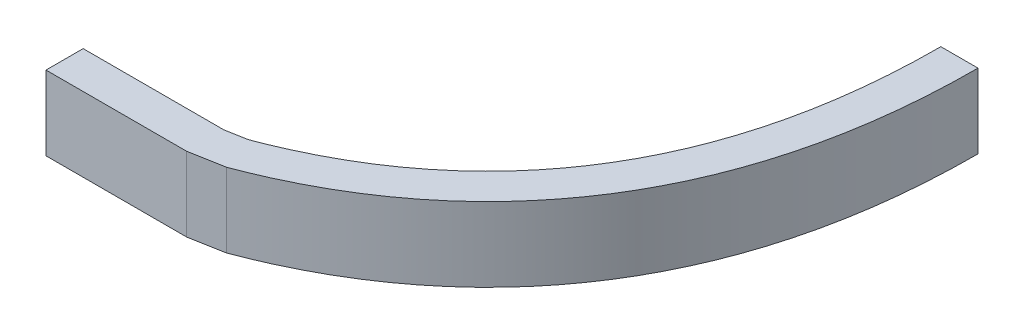
ISO-10303-21;
HEADER;
FILE_DESCRIPTION(('STEP AP214'),'2;1');
FILE_NAME('part.step','',(''),(''),'','','');
FILE_SCHEMA(('AUTOMOTIVE_DESIGN { 1 0 10303 214 1 1 1 1 }'));
ENDSEC;
DATA;
#1=APPLICATION_CONTEXT('core data for automotive mechanical design processes');
#2=APPLICATION_PROTOCOL_DEFINITION('international standard','automotive_design',2000,#1);
#3=PRODUCT_CONTEXT('',#1,'mechanical');
#4=PRODUCT('Part','Part','',(#3));
#5=PRODUCT_RELATED_PRODUCT_CATEGORY('part','',(#4));
#6=PRODUCT_DEFINITION_FORMATION('','',#4);
#7=PRODUCT_DEFINITION_CONTEXT('part definition',#1,'design');
#8=PRODUCT_DEFINITION('design','',#6,#7);
#9=PRODUCT_DEFINITION_SHAPE('','',#8);
#10=(LENGTH_UNIT() NAMED_UNIT(*) SI_UNIT(.MILLI.,.METRE.));
#11=(NAMED_UNIT(*) PLANE_ANGLE_UNIT() SI_UNIT($,.RADIAN.));
#12=(NAMED_UNIT(*) SI_UNIT($,.STERADIAN.) SOLID_ANGLE_UNIT());
#13=UNCERTAINTY_MEASURE_WITH_UNIT(LENGTH_MEASURE(1.E-05),#10,'distance_accuracy_value','');
#14=(GEOMETRIC_REPRESENTATION_CONTEXT(3) GLOBAL_UNCERTAINTY_ASSIGNED_CONTEXT((#13)) GLOBAL_UNIT_ASSIGNED_CONTEXT((#10,
#11,#12)) REPRESENTATION_CONTEXT('',''));
#15=CARTESIAN_POINT('',(0.,0.,0.));
#16=DIRECTION('',(0.,0.,1.));
#17=DIRECTION('',(1.,0.,0.));
#18=AXIS2_PLACEMENT_3D('',#15,#16,#17);
#19=CARTESIAN_POINT('',(-99.9999999999999,0.,0.));
#20=DIRECTION('',(1.,0.,0.));
#21=DIRECTION('',(0.,0.,-1.));
#22=AXIS2_PLACEMENT_3D('',#19,#20,#21);
#23=PLANE('',#22);
#24=DIRECTION('',(0.,0.,1.));
#25=VECTOR('',#24,1.);
#26=CARTESIAN_POINT('',(-99.9999999999999,-0.0001,-29.0149794301952));
#27=LINE('',#26,#25);
#28=CARTESIAN_POINT('',(-99.9999999999999,-0.0001,15.));
#29=VERTEX_POINT('',#28);
#30=CARTESIAN_POINT('',(-99.9999999999999,-0.0001,25.));
#31=VERTEX_POINT('',#30);
#32=EDGE_CURVE('E11',#29,#31,#27,.T.);
#33=ORIENTED_EDGE('',*,*,#32,.T.);
#34=DIRECTION('',(0.,-1.,0.));
#35=VECTOR('',#34,1.);
#36=CARTESIAN_POINT('',(-99.9999999999999,-0.0001,25.));
#37=LINE('',#36,#35);
#38=CARTESIAN_POINT('',(-99.9999999999999,20.,25.));
#39=VERTEX_POINT('',#38);
#40=EDGE_CURVE('E48',#39,#31,#37,.T.);
#41=ORIENTED_EDGE('',*,*,#40,.F.);
#42=DIRECTION('',(0.,0.,1.));
#43=VECTOR('',#42,1.);
#44=CARTESIAN_POINT('',(-99.9999999999999,20.,-29.0149794301952));
#45=LINE('',#44,#43);
#46=CARTESIAN_POINT('',(-99.9999999999999,20.,15.));
#47=VERTEX_POINT('',#46);
#48=EDGE_CURVE('E208',#47,#39,#45,.T.);
#49=ORIENTED_EDGE('',*,*,#48,.F.);
#50=DIRECTION('',(0.,-1.,0.));
#51=VECTOR('',#50,1.);
#52=CARTESIAN_POINT('',(-99.9999999999999,-0.0001,15.));
#53=LINE('',#52,#51);
#54=EDGE_CURVE('E41',#47,#29,#53,.T.);
#55=ORIENTED_EDGE('',*,*,#54,.T.);
#56=EDGE_LOOP('',(#33,#41,#49,#55));
#57=FACE_BOUND('',#56,.T.);
#58=ADVANCED_FACE('F34',(#57),#23,.F.);
#59=CARTESIAN_POINT('',(-56.5192579713654,-0.0001,13.9819282799624));
#60=DIRECTION('',(-0.178366872635727,0.,-0.983964053584352));
#61=DIRECTION('',(-0.983964053584352,0.,0.178366872635727));
#62=AXIS2_PLACEMENT_3D('',#59,#60,#61);
#63=PLANE('',#62);
#64=DIRECTION('',(0.,1.,0.));
#65=VECTOR('',#64,1.);
#66=CARTESIAN_POINT('',(-62.1354688836552,-0.0001,15.));
#67=LINE('',#66,#65);
#68=CARTESIAN_POINT('',(-62.1354688836552,-0.0001,15.));
#69=VERTEX_POINT('',#68);
#70=CARTESIAN_POINT('',(-62.1354688836552,20.,15.));
#71=VERTEX_POINT('',#70);
#72=EDGE_CURVE('E98',#69,#71,#67,.T.);
#73=ORIENTED_EDGE('',*,*,#72,.T.);
#74=DIRECTION('',(-0.983964053584352,0.,0.178366872635727));
#75=VECTOR('',#74,1.);
#76=CARTESIAN_POINT('',(-56.5192579713654,20.,13.9819282799624));
#77=LINE('',#76,#75);
#78=CARTESIAN_POINT('',(-56.5192579713654,20.,13.9819282799624));
#79=VERTEX_POINT('',#78);
#80=EDGE_CURVE('E102',#79,#71,#77,.T.);
#81=ORIENTED_EDGE('',*,*,#80,.F.);
#82=DIRECTION('',(0.,1.,0.));
#83=VECTOR('',#82,1.);
#84=CARTESIAN_POINT('',(-56.5192579713654,-0.0001,13.9819282799624));
#85=LINE('',#84,#83);
#86=CARTESIAN_POINT('',(-56.5192579713654,-0.0001,13.9819282799624));
#87=VERTEX_POINT('',#86);
#88=EDGE_CURVE('E203',#87,#79,#85,.T.);
#89=ORIENTED_EDGE('',*,*,#88,.F.);
#90=DIRECTION('',(-0.983964053584352,0.,0.178366872635727));
#91=VECTOR('',#90,1.);
#92=CARTESIAN_POINT('',(-56.5192579713654,-0.0001,13.9819282799624));
#93=LINE('',#92,#91);
#94=EDGE_CURVE('E104',#87,#69,#93,.T.);
#95=ORIENTED_EDGE('',*,*,#94,.T.);
#96=EDGE_LOOP('',(#73,#81,#89,#95));
#97=FACE_BOUND('',#96,.T.);
#98=ADVANCED_FACE('F100',(#97),#63,.T.);
#99=CARTESIAN_POINT('',(14.9999999985213,-0.0001,-100.89571153749));
#100=CARTESIAN_POINT('',(14.9999760922761,-0.0001,-99.1681233468902));
#101=CARTESIAN_POINT('',(14.9566191165095,-0.0001,-95.6916749710845));
#102=CARTESIAN_POINT('',(14.6949624063233,-0.0001,-88.9122401136793));
#103=CARTESIAN_POINT('',(14.0364767632344,-0.0001,-80.6432986486292));
#104=CARTESIAN_POINT('',(12.7037545374189,-0.0001,-71.0863240461815));
#105=CARTESIAN_POINT('',(10.1854280500236,-0.0001,-58.8227728379707));
#106=CARTESIAN_POINT('',(5.61143073633727,-0.0001,-44.4133384198284));
#107=CARTESIAN_POINT('',(-2.25687395409065,-0.0001,-28.7147909069206));
#108=CARTESIAN_POINT('',(-12.5243122461229,-0.0001,-14.817374534047));
#109=CARTESIAN_POINT('',(-22.9875008503866,-0.0001,-4.92283788919978));
#110=CARTESIAN_POINT('',(-32.3997841521797,-0.0001,1.91556695053269));
#111=CARTESIAN_POINT('',(-39.9512698132157,-0.0001,6.5025416477047));
#112=CARTESIAN_POINT('',(-46.6393695270575,-0.0001,9.87718221685008));
#113=CARTESIAN_POINT('',(-52.2064452304354,-0.0001,12.3082997113222));
#114=CARTESIAN_POINT('',(-55.0795064441192,-0.0001,13.4422148273812));
#115=CARTESIAN_POINT('',(-56.5192579713654,-0.0001,13.9819282799624));
#116=B_SPLINE_CURVE_WITH_KNOTS('',3,(#99,#100,#101,#102,#103,#104,#105,#106,#107,#108,#109,#110,
#111,#112,#113,#114,#115),.UNSPECIFIED.,.F.,.F.,(4,1,1,1,1,1,1,1,1,1,1,1,1,1,4),
(0.497169381797137,0.497311210500095,0.497453039203052,0.497736696608966,0.498020354014881,
0.498304011420796,0.498871326232625,0.499438641044454,0.500005955856283,0.500573270668112,
0.500856928074027,0.501140585479941,0.501424242885856,0.501566071588813,0.50170790029177),.UNSPECIFIED.);
#117=DIRECTION('',(0.,1.,0.));
#118=VECTOR('',#117,1.);
#119=SURFACE_OF_LINEAR_EXTRUSION('',#116,#118);
#120=ORIENTED_EDGE('',*,*,#88,.T.);
#121=CARTESIAN_POINT('',(14.9999999985213,20.,-100.89571153749));
#122=CARTESIAN_POINT('',(14.9999760922761,20.,-99.1681233468902));
#123=CARTESIAN_POINT('',(14.9566191165095,20.,-95.6916749710845));
#124=CARTESIAN_POINT('',(14.6949624063233,20.,-88.9122401136793));
#125=CARTESIAN_POINT('',(14.0364767632344,20.,-80.6432986486292));
#126=CARTESIAN_POINT('',(12.7037545374189,20.,-71.0863240461815));
#127=CARTESIAN_POINT('',(10.1854280500236,20.,-58.8227728379707));
#128=CARTESIAN_POINT('',(5.61143073633727,20.,-44.4133384198284));
#129=CARTESIAN_POINT('',(-2.25687395409065,20.,-28.7147909069206));
#130=CARTESIAN_POINT('',(-12.5243122461229,20.,-14.817374534047));
#131=CARTESIAN_POINT('',(-22.9875008503866,20.,-4.92283788919978));
#132=CARTESIAN_POINT('',(-32.3997841521797,20.,1.91556695053269));
#133=CARTESIAN_POINT('',(-39.9512698132157,20.,6.5025416477047));
#134=CARTESIAN_POINT('',(-46.6393695270575,20.,9.87718221685008));
#135=CARTESIAN_POINT('',(-52.2064452304354,20.,12.3082997113222));
#136=CARTESIAN_POINT('',(-55.0795064441192,20.,13.4422148273812));
#137=CARTESIAN_POINT('',(-56.5192579713654,20.,13.9819282799624));
#138=B_SPLINE_CURVE_WITH_KNOTS('',3,(#121,#122,#123,#124,#125,#126,#127,#128,#129,#130,#131,
#132,#133,#134,#135,#136,#137),.UNSPECIFIED.,.F.,.F.,(4,1,1,1,1,1,1,1,1,1,1,1,1,1,4),
(0.497169381797137,0.497311210500095,0.497453039203052,0.497736696608966,0.498020354014881,
0.498304011420796,0.498871326232625,0.499438641044454,0.500005955856283,0.500573270668112,
0.500856928074027,0.501140585479941,0.501424242885856,0.501566071588813,0.50170790029177),.UNSPECIFIED.);
#139=CARTESIAN_POINT('',(14.9999999985213,20.,-100.89571153749));
#140=VERTEX_POINT('',#139);
#141=EDGE_CURVE('E121',#140,#79,#138,.T.);
#142=ORIENTED_EDGE('',*,*,#141,.F.);
#143=DIRECTION('',(0.,1.,0.));
#144=VECTOR('',#143,1.);
#145=CARTESIAN_POINT('',(14.9999999985213,-0.0001,-100.89571153749));
#146=LINE('',#145,#144);
#147=CARTESIAN_POINT('',(14.9999999985213,-0.0001,-100.89571153749));
#148=VERTEX_POINT('',#147);
#149=EDGE_CURVE('E209',#148,#140,#146,.T.);
#150=ORIENTED_EDGE('',*,*,#149,.F.);
#151=EDGE_CURVE('E109',#148,#87,#116,.T.);
#152=ORIENTED_EDGE('',*,*,#151,.T.);
#153=EDGE_LOOP('',(#120,#142,#150,#152));
#154=FACE_BOUND('',#153,.T.);
#155=ADVANCED_FACE('F179',(#154),#119,.T.);
#156=CARTESIAN_POINT('',(24.9999999975639,-0.0001,-100.895573158185));
#157=DIRECTION('',(1.38379304709391E-05,0.,-0.999999999904256));
#158=DIRECTION('',(-0.999999999904256,0.,-1.38379304709391E-05));
#159=AXIS2_PLACEMENT_3D('',#156,#157,#158);
#160=PLANE('',#159);
#161=ORIENTED_EDGE('',*,*,#149,.T.);
#162=DIRECTION('',(-0.999999999904256,0.,-1.38379304709391E-05));
#163=VECTOR('',#162,1.);
#164=CARTESIAN_POINT('',(24.9999999975639,20.,-100.895573158185));
#165=LINE('',#164,#163);
#166=CARTESIAN_POINT('',(24.9999999975639,20.,-100.895573158185));
#167=VERTEX_POINT('',#166);
#168=EDGE_CURVE('E133',#167,#140,#165,.T.);
#169=ORIENTED_EDGE('',*,*,#168,.F.);
#170=DIRECTION('',(0.,1.,0.));
#171=VECTOR('',#170,1.);
#172=CARTESIAN_POINT('',(24.9999999975639,-0.0001,-100.895573158185));
#173=LINE('',#172,#171);
#174=CARTESIAN_POINT('',(24.9999999975639,-0.0001,-100.895573158185));
#175=VERTEX_POINT('',#174);
#176=EDGE_CURVE('E211',#175,#167,#173,.T.);
#177=ORIENTED_EDGE('',*,*,#176,.F.);
#178=DIRECTION('',(-0.999999999904256,0.,-1.38379304709391E-05));
#179=VECTOR('',#178,1.);
#180=CARTESIAN_POINT('',(24.9999999975639,-0.0001,-100.895573158185));
#181=LINE('',#180,#179);
#182=EDGE_CURVE('E157',#175,#148,#181,.T.);
#183=ORIENTED_EDGE('',*,*,#182,.T.);
#184=EDGE_LOOP('',(#161,#169,#177,#183));
#185=FACE_BOUND('',#184,.T.);
#186=ADVANCED_FACE('F168',(#185),#160,.T.);
#187=CARTESIAN_POINT('',(24.9999999975639,-0.0001,-100.895573158185));
#188=CARTESIAN_POINT('',(24.9999749193085,-0.0001,-99.0832894886722));
#189=CARTESIAN_POINT('',(24.9545586216953,-0.0001,-95.4401566477499));
#190=CARTESIAN_POINT('',(24.6794151253527,-0.0001,-88.3058653043741));
#191=CARTESIAN_POINT('',(23.9842422869495,-0.0001,-79.5673873036031));
#192=CARTESIAN_POINT('',(22.5675853146108,-0.0001,-69.400652288718));
#193=CARTESIAN_POINT('',(19.8721468229475,-0.0001,-56.2671034684981));
#194=CARTESIAN_POINT('',(14.9304938551201,-0.0001,-40.6729785053224));
#195=CARTESIAN_POINT('',(6.32177961772284,-0.0001,-23.4793132986705));
#196=CARTESIAN_POINT('',(-4.99830253339503,-0.0001,-8.15181538874649));
#197=CARTESIAN_POINT('',(-16.5375876590482,-0.0001,2.75645073198255));
#198=CARTESIAN_POINT('',(-26.8612764831602,-0.0001,10.2553723726646));
#199=CARTESIAN_POINT('',(-35.1037927610427,-0.0001,15.2608319152051));
#200=CARTESIAN_POINT('',(-42.3596359150804,-0.0001,18.9209610577229));
#201=CARTESIAN_POINT('',(-48.372096921907,-0.0001,21.546243442583));
#202=CARTESIAN_POINT('',(-51.459903731426,-0.0001,22.7648831205386));
#203=CARTESIAN_POINT('',(-53.0091261511668,-0.0001,23.3456334549895));
#204=B_SPLINE_CURVE_WITH_KNOTS('',3,(#187,#188,#189,#190,#191,#192,#193,#194,#195,#196,#197,
#198,#199,#200,#201,#202,#203),.UNSPECIFIED.,.F.,.F.,(4,1,1,1,1,1,1,1,1,1,1,1,1,1,4),
(0.497169381797137,0.497311210500095,0.497453039203052,0.497736696608966,0.498020354014881,
0.498304011420796,0.498871326232625,0.499438641044454,0.500005955856283,0.500573270668112,
0.500856928074027,0.501140585479941,0.501424242885856,0.501566071588813,0.50170790029177),.UNSPECIFIED.);
#205=DIRECTION('',(0.,1.,0.));
#206=VECTOR('',#205,1.);
#207=SURFACE_OF_LINEAR_EXTRUSION('',#204,#206);
#208=ORIENTED_EDGE('',*,*,#176,.T.);
#209=CARTESIAN_POINT('',(24.9999999975639,20.,-100.895573158185));
#210=CARTESIAN_POINT('',(24.9999749193085,20.,-99.0832894886722));
#211=CARTESIAN_POINT('',(24.9545586216953,20.,-95.4401566477499));
#212=CARTESIAN_POINT('',(24.6794151253527,20.,-88.3058653043741));
#213=CARTESIAN_POINT('',(23.9842422869495,20.,-79.5673873036031));
#214=CARTESIAN_POINT('',(22.5675853146108,20.,-69.400652288718));
#215=CARTESIAN_POINT('',(19.8721468229475,20.,-56.2671034684981));
#216=CARTESIAN_POINT('',(14.9304938551201,20.,-40.6729785053224));
#217=CARTESIAN_POINT('',(6.32177961772284,20.,-23.4793132986705));
#218=CARTESIAN_POINT('',(-4.99830253339503,20.,-8.15181538874649));
#219=CARTESIAN_POINT('',(-16.5375876590482,20.,2.75645073198255));
#220=CARTESIAN_POINT('',(-26.8612764831602,20.,10.2553723726646));
#221=CARTESIAN_POINT('',(-35.1037927610427,20.,15.2608319152051));
#222=CARTESIAN_POINT('',(-42.3596359150804,20.,18.9209610577229));
#223=CARTESIAN_POINT('',(-48.372096921907,20.,21.546243442583));
#224=CARTESIAN_POINT('',(-51.459903731426,20.,22.7648831205386));
#225=CARTESIAN_POINT('',(-53.0091261511668,20.,23.3456334549895));
#226=B_SPLINE_CURVE_WITH_KNOTS('',3,(#209,#210,#211,#212,#213,#214,#215,#216,#217,#218,#219,
#220,#221,#222,#223,#224,#225),.UNSPECIFIED.,.F.,.F.,(4,1,1,1,1,1,1,1,1,1,1,1,1,1,4),
(0.497169381797137,0.497311210500095,0.497453039203052,0.497736696608966,0.498020354014881,
0.498304011420796,0.498871326232625,0.499438641044454,0.500005955856283,0.500573270668112,
0.500856928074027,0.501140585479941,0.501424242885856,0.501566071588813,0.50170790029177),.UNSPECIFIED.);
#227=CARTESIAN_POINT('',(-53.0091261511668,20.,23.3456334549895));
#228=VERTEX_POINT('',#227);
#229=EDGE_CURVE('E128',#167,#228,#226,.T.);
#230=ORIENTED_EDGE('',*,*,#229,.T.);
#231=DIRECTION('',(0.,1.,0.));
#232=VECTOR('',#231,1.);
#233=CARTESIAN_POINT('',(-53.0091261511668,-0.0001,23.3456334549895));
#234=LINE('',#233,#232);
#235=CARTESIAN_POINT('',(-53.0091261511668,-0.0001,23.3456334549895));
#236=VERTEX_POINT('',#235);
#237=EDGE_CURVE('E213',#236,#228,#234,.T.);
#238=ORIENTED_EDGE('',*,*,#237,.F.);
#239=EDGE_CURVE('E152',#175,#236,#204,.T.);
#240=ORIENTED_EDGE('',*,*,#239,.F.);
#241=EDGE_LOOP('',(#208,#230,#238,#240));
#242=FACE_BOUND('',#241,.T.);
#243=ADVANCED_FACE('F163',(#242),#207,.F.);
#244=CARTESIAN_POINT('',(-53.0091261511668,-0.0001,23.3456334549895));
#245=DIRECTION('',(-0.178366872630116,0.,-0.98396405358537));
#246=DIRECTION('',(-0.98396405358537,0.,0.178366872630116));
#247=AXIS2_PLACEMENT_3D('',#244,#245,#246);
#248=PLANE('',#247);
#249=ORIENTED_EDGE('',*,*,#237,.T.);
#250=DIRECTION('',(-0.98396405358537,0.,0.178366872630116));
#251=VECTOR('',#250,1.);
#252=CARTESIAN_POINT('',(-53.0091261511668,20.,23.3456334549895));
#253=LINE('',#252,#251);
#254=CARTESIAN_POINT('',(-62.1354688836552,20.,25.));
#255=VERTEX_POINT('',#254);
#256=EDGE_CURVE('E125',#228,#255,#253,.T.);
#257=ORIENTED_EDGE('',*,*,#256,.T.);
#258=DIRECTION('',(0.,1.,0.));
#259=VECTOR('',#258,1.);
#260=CARTESIAN_POINT('',(-62.1354688836552,-0.0001,25.));
#261=LINE('',#260,#259);
#262=CARTESIAN_POINT('',(-62.1354688836552,-0.0001,25.));
#263=VERTEX_POINT('',#262);
#264=EDGE_CURVE('E108',#263,#255,#261,.T.);
#265=ORIENTED_EDGE('',*,*,#264,.F.);
#266=DIRECTION('',(-0.98396405358537,0.,0.178366872630116));
#267=VECTOR('',#266,1.);
#268=CARTESIAN_POINT('',(-53.0091261511668,-0.0001,23.3456334549895));
#269=LINE('',#268,#267);
#270=EDGE_CURVE('E150',#236,#263,#269,.T.);
#271=ORIENTED_EDGE('',*,*,#270,.F.);
#272=EDGE_LOOP('',(#249,#257,#265,#271));
#273=FACE_BOUND('',#272,.T.);
#274=ADVANCED_FACE('F167',(#273),#248,.F.);
#275=CARTESIAN_POINT('',(-62.1354688836552,-0.0001,25.));
#276=DIRECTION('',(0.,0.,-1.));
#277=DIRECTION('',(-1.,0.,0.));
#278=AXIS2_PLACEMENT_3D('',#275,#276,#277);
#279=PLANE('',#278);
#280=DIRECTION('',(-1.,0.,0.));
#281=VECTOR('',#280,1.);
#282=CARTESIAN_POINT('',(-62.1354688836552,20.,25.));
#283=LINE('',#282,#281);
#284=EDGE_CURVE('E115',#255,#39,#283,.T.);
#285=ORIENTED_EDGE('',*,*,#284,.T.);
#286=ORIENTED_EDGE('',*,*,#40,.T.);
#287=DIRECTION('',(-1.,0.,0.));
#288=VECTOR('',#287,1.);
#289=CARTESIAN_POINT('',(-62.1354688836552,-0.0001,25.));
#290=LINE('',#289,#288);
#291=EDGE_CURVE('E147',#263,#31,#290,.T.);
#292=ORIENTED_EDGE('',*,*,#291,.F.);
#293=ORIENTED_EDGE('',*,*,#264,.T.);
#294=EDGE_LOOP('',(#285,#286,#292,#293));
#295=FACE_BOUND('',#294,.T.);
#296=ADVANCED_FACE('F173',(#295),#279,.F.);
#297=CARTESIAN_POINT('',(-62.1354688836552,-0.0001,15.));
#298=DIRECTION('',(0.,0.,-1.));
#299=DIRECTION('',(-1.,0.,0.));
#300=AXIS2_PLACEMENT_3D('',#297,#298,#299);
#301=PLANE('',#300);
#302=ORIENTED_EDGE('',*,*,#54,.F.);
#303=DIRECTION('',(-1.,0.,0.));
#304=VECTOR('',#303,1.);
#305=CARTESIAN_POINT('',(-62.1354688836552,20.,15.));
#306=LINE('',#305,#304);
#307=EDGE_CURVE('E112',#71,#47,#306,.T.);
#308=ORIENTED_EDGE('',*,*,#307,.F.);
#309=ORIENTED_EDGE('',*,*,#72,.F.);
#310=DIRECTION('',(-1.,0.,0.));
#311=VECTOR('',#310,1.);
#312=CARTESIAN_POINT('',(-62.1354688836552,-0.0001,15.));
#313=LINE('',#312,#311);
#314=EDGE_CURVE('E145',#69,#29,#313,.T.);
#315=ORIENTED_EDGE('',*,*,#314,.T.);
#316=EDGE_LOOP('',(#302,#308,#309,#315));
#317=FACE_BOUND('',#316,.T.);
#318=ADVANCED_FACE('F113',(#317),#301,.T.);
#319=CARTESIAN_POINT('',(-197.343270445668,20.,-29.0149794301952));
#320=DIRECTION('',(0.,-1.,0.));
#321=DIRECTION('',(0.,0.,-1.));
#322=AXIS2_PLACEMENT_3D('',#319,#320,#321);
#323=PLANE('',#322);
#324=ORIENTED_EDGE('',*,*,#307,.T.);
#325=ORIENTED_EDGE('',*,*,#48,.T.);
#326=ORIENTED_EDGE('',*,*,#284,.F.);
#327=ORIENTED_EDGE('',*,*,#256,.F.);
#328=ORIENTED_EDGE('',*,*,#229,.F.);
#329=ORIENTED_EDGE('',*,*,#168,.T.);
#330=ORIENTED_EDGE('',*,*,#141,.T.);
#331=ORIENTED_EDGE('',*,*,#80,.T.);
#332=EDGE_LOOP('',(#324,#325,#326,#327,#328,#329,#330,#331));
#333=FACE_BOUND('',#332,.T.);
#334=ADVANCED_FACE('F118',(#333),#323,.F.);
#335=CARTESIAN_POINT('',(-197.343270445668,-0.0001,-29.0149794301952));
#336=DIRECTION('',(0.,-1.,0.));
#337=DIRECTION('',(0.,0.,-1.));
#338=AXIS2_PLACEMENT_3D('',#335,#336,#337);
#339=PLANE('',#338);
#340=ORIENTED_EDGE('',*,*,#32,.F.);
#341=ORIENTED_EDGE('',*,*,#314,.F.);
#342=ORIENTED_EDGE('',*,*,#94,.F.);
#343=ORIENTED_EDGE('',*,*,#151,.F.);
#344=ORIENTED_EDGE('',*,*,#182,.F.);
#345=ORIENTED_EDGE('',*,*,#239,.T.);
#346=ORIENTED_EDGE('',*,*,#270,.T.);
#347=ORIENTED_EDGE('',*,*,#291,.T.);
#348=EDGE_LOOP('',(#340,#341,#342,#343,#344,#345,#346,#347));
#349=FACE_BOUND('',#348,.T.);
#350=ADVANCED_FACE('F187',(#349),#339,.T.);
#351=CLOSED_SHELL('',(#58,#98,#155,#186,#243,#274,#296,#318,#334,#350));
#352=MANIFOLD_SOLID_BREP('B2',#351);
#353=ADVANCED_BREP_SHAPE_REPRESENTATION('',(#18,#352),#14);
#354=SHAPE_DEFINITION_REPRESENTATION(#9,#353);
ENDSEC;
END-ISO-10303-21;
